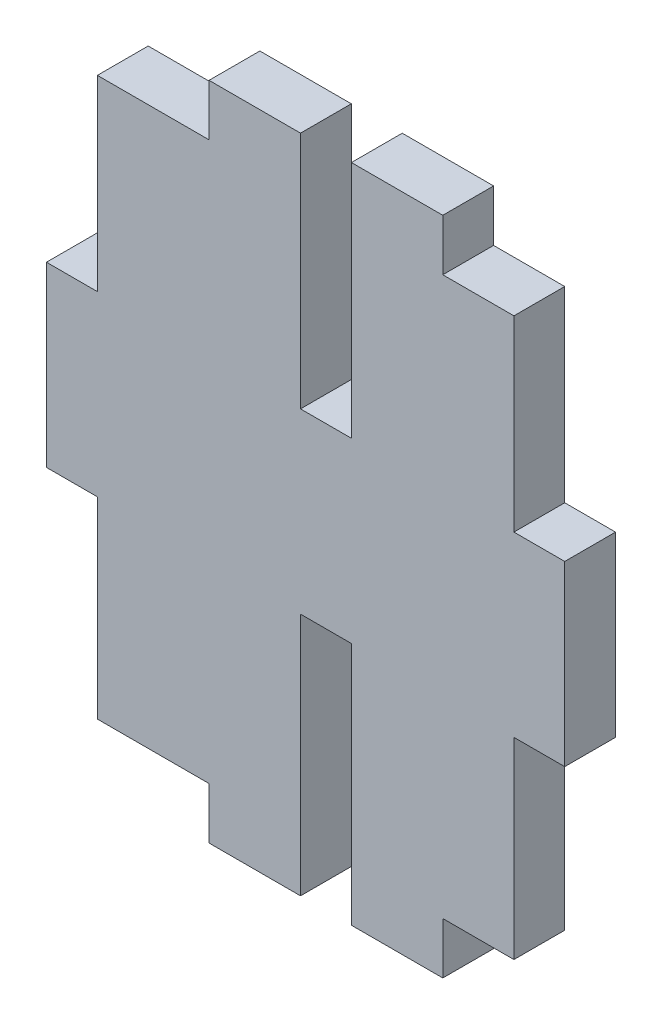
ISO-10303-21;
HEADER;
FILE_DESCRIPTION(('STEP AP214'),'2;1');
FILE_NAME('part.step','',(''),(''),'','','');
FILE_SCHEMA(('AUTOMOTIVE_DESIGN { 1 0 10303 214 1 1 1 1 }'));
ENDSEC;
DATA;
#1=APPLICATION_CONTEXT('core data for automotive mechanical design processes');
#2=APPLICATION_PROTOCOL_DEFINITION('international standard','automotive_design',2000,#1);
#3=PRODUCT_CONTEXT('',#1,'mechanical');
#4=PRODUCT('Part','Part','',(#3));
#5=PRODUCT_RELATED_PRODUCT_CATEGORY('part','',(#4));
#6=PRODUCT_DEFINITION_FORMATION('','',#4);
#7=PRODUCT_DEFINITION_CONTEXT('part definition',#1,'design');
#8=PRODUCT_DEFINITION('design','',#6,#7);
#9=PRODUCT_DEFINITION_SHAPE('','',#8);
#10=(LENGTH_UNIT() NAMED_UNIT(*) SI_UNIT(.MILLI.,.METRE.));
#11=(NAMED_UNIT(*) PLANE_ANGLE_UNIT() SI_UNIT($,.RADIAN.));
#12=(NAMED_UNIT(*) SI_UNIT($,.STERADIAN.) SOLID_ANGLE_UNIT());
#13=UNCERTAINTY_MEASURE_WITH_UNIT(LENGTH_MEASURE(1.E-05),#10,'distance_accuracy_value','');
#14=(GEOMETRIC_REPRESENTATION_CONTEXT(3) GLOBAL_UNCERTAINTY_ASSIGNED_CONTEXT((#13)) GLOBAL_UNIT_ASSIGNED_CONTEXT((#10,
#11,#12)) REPRESENTATION_CONTEXT('',''));
#15=CARTESIAN_POINT('',(0.,0.,0.));
#16=DIRECTION('',(0.,0.,1.));
#17=DIRECTION('',(1.,0.,0.));
#18=AXIS2_PLACEMENT_3D('',#15,#16,#17);
#19=CARTESIAN_POINT('',(25.5,-32.5,5.));
#20=DIRECTION('',(0.,1.,0.));
#21=DIRECTION('',(0.,0.,1.));
#22=AXIS2_PLACEMENT_3D('',#19,#20,#21);
#23=PLANE('',#22);
#24=DIRECTION('',(1.,0.,0.));
#25=VECTOR('',#24,1.);
#26=CARTESIAN_POINT('',(25.5,-32.5,5.));
#27=LINE('',#26,#25);
#28=CARTESIAN_POINT('',(-9.49999999999998,-32.5,5.));
#29=VERTEX_POINT('',#28);
#30=CARTESIAN_POINT('',(-0.499999999999983,-32.5,5.));
#31=VERTEX_POINT('',#30);
#32=EDGE_CURVE('E233',#29,#31,#27,.T.);
#33=ORIENTED_EDGE('',*,*,#32,.F.);
#34=DIRECTION('',(0.,0.,1.));
#35=VECTOR('',#34,1.);
#36=CARTESIAN_POINT('',(-9.49999999999998,-32.5,0.));
#37=LINE('',#36,#35);
#38=CARTESIAN_POINT('',(-9.49999999999998,-32.5,0.));
#39=VERTEX_POINT('',#38);
#40=EDGE_CURVE('E219',#39,#29,#37,.T.);
#41=ORIENTED_EDGE('',*,*,#40,.F.);
#42=DIRECTION('',(1.,0.,0.));
#43=VECTOR('',#42,1.);
#44=CARTESIAN_POINT('',(25.5,-32.5,0.));
#45=LINE('',#44,#43);
#46=CARTESIAN_POINT('',(-0.499999999999983,-32.5,0.));
#47=VERTEX_POINT('',#46);
#48=EDGE_CURVE('E231',#39,#47,#45,.T.);
#49=ORIENTED_EDGE('',*,*,#48,.T.);
#50=DIRECTION('',(0.,0.,1.));
#51=VECTOR('',#50,1.);
#52=CARTESIAN_POINT('',(-0.499999999999983,-32.5,0.));
#53=LINE('',#52,#51);
#54=EDGE_CURVE('E422',#47,#31,#53,.T.);
#55=ORIENTED_EDGE('',*,*,#54,.T.);
#56=EDGE_LOOP('',(#33,#41,#49,#55));
#57=FACE_BOUND('',#56,.T.);
#58=ADVANCED_FACE('F32',(#57),#23,.F.);
#59=CARTESIAN_POINT('',(25.5,32.5,5.));
#60=DIRECTION('',(0.,-1.,0.));
#61=DIRECTION('',(1.,0.,0.));
#62=AXIS2_PLACEMENT_3D('',#59,#60,#61);
#63=PLANE('',#62);
#64=DIRECTION('',(-1.,0.,0.));
#65=VECTOR('',#64,1.);
#66=CARTESIAN_POINT('',(25.5,32.5,0.));
#67=LINE('',#66,#65);
#68=CARTESIAN_POINT('',(-0.499999999999987,32.5,0.));
#69=VERTEX_POINT('',#68);
#70=CARTESIAN_POINT('',(-9.49999999999999,32.5,0.));
#71=VERTEX_POINT('',#70);
#72=EDGE_CURVE('E243',#69,#71,#67,.T.);
#73=ORIENTED_EDGE('',*,*,#72,.T.);
#74=DIRECTION('',(0.,0.,1.));
#75=VECTOR('',#74,1.);
#76=CARTESIAN_POINT('',(-9.49999999999999,32.5,0.));
#77=LINE('',#76,#75);
#78=CARTESIAN_POINT('',(-9.49999999999999,32.5,5.));
#79=VERTEX_POINT('',#78);
#80=EDGE_CURVE('E368',#71,#79,#77,.T.);
#81=ORIENTED_EDGE('',*,*,#80,.T.);
#82=DIRECTION('',(-1.,0.,0.));
#83=VECTOR('',#82,1.);
#84=CARTESIAN_POINT('',(25.5,32.5,5.));
#85=LINE('',#84,#83);
#86=CARTESIAN_POINT('',(-0.499999999999987,32.5,5.));
#87=VERTEX_POINT('',#86);
#88=EDGE_CURVE('E352',#87,#79,#85,.T.);
#89=ORIENTED_EDGE('',*,*,#88,.F.);
#90=DIRECTION('',(0.,0.,1.));
#91=VECTOR('',#90,1.);
#92=CARTESIAN_POINT('',(-0.499999999999987,32.5,0.));
#93=LINE('',#92,#91);
#94=EDGE_CURVE('E308',#69,#87,#93,.T.);
#95=ORIENTED_EDGE('',*,*,#94,.F.);
#96=EDGE_LOOP('',(#73,#81,#89,#95));
#97=FACE_BOUND('',#96,.T.);
#98=ADVANCED_FACE('F366',(#97),#63,.F.);
#99=CARTESIAN_POINT('',(-25.5,-32.5,5.));
#100=DIRECTION('',(1.,0.,0.));
#101=DIRECTION('',(0.,0.,-1.));
#102=AXIS2_PLACEMENT_3D('',#99,#100,#101);
#103=PLANE('',#102);
#104=DIRECTION('',(0.,-1.,0.));
#105=VECTOR('',#104,1.);
#106=CARTESIAN_POINT('',(-25.5,-32.5,0.));
#107=LINE('',#106,#105);
#108=CARTESIAN_POINT('',(-25.5,9.,0.));
#109=VERTEX_POINT('',#108);
#110=CARTESIAN_POINT('',(-25.5,-8.49,0.));
#111=VERTEX_POINT('',#110);
#112=EDGE_CURVE('E246',#109,#111,#107,.T.);
#113=ORIENTED_EDGE('',*,*,#112,.T.);
#114=DIRECTION('',(0.,0.,1.));
#115=VECTOR('',#114,1.);
#116=CARTESIAN_POINT('',(-25.5,-8.49,0.));
#117=LINE('',#116,#115);
#118=CARTESIAN_POINT('',(-25.5,-8.49,5.));
#119=VERTEX_POINT('',#118);
#120=EDGE_CURVE('E326',#111,#119,#117,.T.);
#121=ORIENTED_EDGE('',*,*,#120,.T.);
#122=DIRECTION('',(0.,-1.,0.));
#123=VECTOR('',#122,1.);
#124=CARTESIAN_POINT('',(-25.5,-32.5,5.));
#125=LINE('',#124,#123);
#126=CARTESIAN_POINT('',(-25.5,9.,5.));
#127=VERTEX_POINT('',#126);
#128=EDGE_CURVE('E252',#127,#119,#125,.T.);
#129=ORIENTED_EDGE('',*,*,#128,.F.);
#130=DIRECTION('',(0.,0.,1.));
#131=VECTOR('',#130,1.);
#132=CARTESIAN_POINT('',(-25.5,9.,0.));
#133=LINE('',#132,#131);
#134=EDGE_CURVE('E339',#109,#127,#133,.T.);
#135=ORIENTED_EDGE('',*,*,#134,.F.);
#136=EDGE_LOOP('',(#113,#121,#129,#135));
#137=FACE_BOUND('',#136,.T.);
#138=ADVANCED_FACE('F34',(#137),#103,.F.);
#139=CARTESIAN_POINT('',(4.51000000000002,-32.5,0.));
#140=VERTEX_POINT('',#139);
#141=CARTESIAN_POINT('',(13.5,-32.5,0.));
#142=VERTEX_POINT('',#141);
#143=EDGE_CURVE('E241',#140,#142,#45,.T.);
#144=ORIENTED_EDGE('',*,*,#143,.T.);
#145=DIRECTION('',(0.,0.,1.));
#146=VECTOR('',#145,1.);
#147=CARTESIAN_POINT('',(13.5,-32.5,0.));
#148=LINE('',#147,#146);
#149=CARTESIAN_POINT('',(13.5,-32.5,5.));
#150=VERTEX_POINT('',#149);
#151=EDGE_CURVE('E393',#142,#150,#148,.T.);
#152=ORIENTED_EDGE('',*,*,#151,.T.);
#153=CARTESIAN_POINT('',(4.51000000000002,-32.5,5.));
#154=VERTEX_POINT('',#153);
#155=EDGE_CURVE('E349',#154,#150,#27,.T.);
#156=ORIENTED_EDGE('',*,*,#155,.F.);
#157=DIRECTION('',(0.,0.,1.));
#158=VECTOR('',#157,1.);
#159=CARTESIAN_POINT('',(4.51000000000002,-32.5,0.));
#160=LINE('',#159,#158);
#161=EDGE_CURVE('E431',#140,#154,#160,.T.);
#162=ORIENTED_EDGE('',*,*,#161,.F.);
#163=EDGE_LOOP('',(#144,#152,#156,#162));
#164=FACE_BOUND('',#163,.T.);
#165=ADVANCED_FACE('F461',(#164),#23,.F.);
#166=CARTESIAN_POINT('',(25.5,-32.5,5.));
#167=DIRECTION('',(-1.,0.,0.));
#168=DIRECTION('',(0.,0.,1.));
#169=AXIS2_PLACEMENT_3D('',#166,#167,#168);
#170=PLANE('',#169);
#171=DIRECTION('',(0.,1.,0.));
#172=VECTOR('',#171,1.);
#173=CARTESIAN_POINT('',(25.5,-32.5,5.));
#174=LINE('',#173,#172);
#175=CARTESIAN_POINT('',(25.5,-8.49,5.));
#176=VERTEX_POINT('',#175);
#177=CARTESIAN_POINT('',(25.5,9.,5.));
#178=VERTEX_POINT('',#177);
#179=EDGE_CURVE('E351',#176,#178,#174,.T.);
#180=ORIENTED_EDGE('',*,*,#179,.F.);
#181=DIRECTION('',(0.,0.,1.));
#182=VECTOR('',#181,1.);
#183=CARTESIAN_POINT('',(25.5,-8.49,0.));
#184=LINE('',#183,#182);
#185=CARTESIAN_POINT('',(25.5,-8.49,0.));
#186=VERTEX_POINT('',#185);
#187=EDGE_CURVE('E406',#186,#176,#184,.T.);
#188=ORIENTED_EDGE('',*,*,#187,.F.);
#189=DIRECTION('',(0.,1.,0.));
#190=VECTOR('',#189,1.);
#191=CARTESIAN_POINT('',(25.5,-32.5,0.));
#192=LINE('',#191,#190);
#193=CARTESIAN_POINT('',(25.5,9.,0.));
#194=VERTEX_POINT('',#193);
#195=EDGE_CURVE('E240',#186,#194,#192,.T.);
#196=ORIENTED_EDGE('',*,*,#195,.T.);
#197=DIRECTION('',(0.,0.,1.));
#198=VECTOR('',#197,1.);
#199=CARTESIAN_POINT('',(25.5,9.,0.));
#200=LINE('',#199,#198);
#201=EDGE_CURVE('E284',#194,#178,#200,.T.);
#202=ORIENTED_EDGE('',*,*,#201,.T.);
#203=EDGE_LOOP('',(#180,#188,#196,#202));
#204=FACE_BOUND('',#203,.T.);
#205=ADVANCED_FACE('F441',(#204),#170,.F.);
#206=CARTESIAN_POINT('',(13.5,32.5,5.));
#207=VERTEX_POINT('',#206);
#208=CARTESIAN_POINT('',(4.51000000000001,32.5,5.));
#209=VERTEX_POINT('',#208);
#210=EDGE_CURVE('E257',#207,#209,#85,.T.);
#211=ORIENTED_EDGE('',*,*,#210,.F.);
#212=DIRECTION('',(0.,0.,1.));
#213=VECTOR('',#212,1.);
#214=CARTESIAN_POINT('',(13.5,32.5,0.));
#215=LINE('',#214,#213);
#216=CARTESIAN_POINT('',(13.5,32.5,0.));
#217=VERTEX_POINT('',#216);
#218=EDGE_CURVE('E490',#217,#207,#215,.T.);
#219=ORIENTED_EDGE('',*,*,#218,.F.);
#220=CARTESIAN_POINT('',(4.51000000000001,32.5,0.));
#221=VERTEX_POINT('',#220);
#222=EDGE_CURVE('E250',#217,#221,#67,.T.);
#223=ORIENTED_EDGE('',*,*,#222,.T.);
#224=DIRECTION('',(0.,0.,1.));
#225=VECTOR('',#224,1.);
#226=CARTESIAN_POINT('',(4.51000000000001,32.5,0.));
#227=LINE('',#226,#225);
#228=EDGE_CURVE('E311',#221,#209,#227,.T.);
#229=ORIENTED_EDGE('',*,*,#228,.T.);
#230=EDGE_LOOP('',(#211,#219,#223,#229));
#231=FACE_BOUND('',#230,.T.);
#232=ADVANCED_FACE('F534',(#231),#63,.F.);
#233=CARTESIAN_POINT('',(0.,0.,5.));
#234=DIRECTION('',(0.,0.,1.));
#235=DIRECTION('',(1.,0.,0.));
#236=AXIS2_PLACEMENT_3D('',#233,#234,#235);
#237=PLANE('',#236);
#238=DIRECTION('',(-1.,0.,0.));
#239=VECTOR('',#238,1.);
#240=CARTESIAN_POINT('',(-9.49999999999998,-27.43,5.));
#241=LINE('',#240,#239);
#242=CARTESIAN_POINT('',(-9.49999999999998,-27.43,5.));
#243=VERTEX_POINT('',#242);
#244=CARTESIAN_POINT('',(-20.49,-27.43,5.));
#245=VERTEX_POINT('',#244);
#246=EDGE_CURVE('E47',#243,#245,#241,.T.);
#247=ORIENTED_EDGE('',*,*,#246,.F.);
#248=DIRECTION('',(0.,1.,0.));
#249=VECTOR('',#248,1.);
#250=CARTESIAN_POINT('',(-9.49999999999998,-32.5,5.));
#251=LINE('',#250,#249);
#252=EDGE_CURVE('E473',#29,#243,#251,.T.);
#253=ORIENTED_EDGE('',*,*,#252,.F.);
#254=ORIENTED_EDGE('',*,*,#32,.T.);
#255=DIRECTION('',(0.,-1.,0.));
#256=VECTOR('',#255,1.);
#257=CARTESIAN_POINT('',(-0.499999999999986,-8.48999999999999,5.));
#258=LINE('',#257,#256);
#259=CARTESIAN_POINT('',(-0.499999999999986,-8.48999999999999,5.));
#260=VERTEX_POINT('',#259);
#261=EDGE_CURVE('E413',#260,#31,#258,.T.);
#262=ORIENTED_EDGE('',*,*,#261,.F.);
#263=DIRECTION('',(-1.,0.,0.));
#264=VECTOR('',#263,1.);
#265=CARTESIAN_POINT('',(-0.499999999999986,-8.48999999999999,5.));
#266=LINE('',#265,#264);
#267=CARTESIAN_POINT('',(4.51000000000001,-8.48999999999999,5.));
#268=VERTEX_POINT('',#267);
#269=EDGE_CURVE('E417',#268,#260,#266,.T.);
#270=ORIENTED_EDGE('',*,*,#269,.F.);
#271=DIRECTION('',(0.,1.,0.));
#272=VECTOR('',#271,1.);
#273=CARTESIAN_POINT('',(4.51000000000001,-8.48999999999999,5.));
#274=LINE('',#273,#272);
#275=EDGE_CURVE('E425',#154,#268,#274,.T.);
#276=ORIENTED_EDGE('',*,*,#275,.F.);
#277=ORIENTED_EDGE('',*,*,#155,.T.);
#278=DIRECTION('',(0.,-1.,0.));
#279=VECTOR('',#278,1.);
#280=CARTESIAN_POINT('',(13.5,-32.5,5.));
#281=LINE('',#280,#279);
#282=CARTESIAN_POINT('',(13.5,-27.43,5.));
#283=VERTEX_POINT('',#282);
#284=EDGE_CURVE('E387',#283,#150,#281,.T.);
#285=ORIENTED_EDGE('',*,*,#284,.F.);
#286=DIRECTION('',(-1.,0.,0.));
#287=VECTOR('',#286,1.);
#288=CARTESIAN_POINT('',(13.5,-27.43,5.));
#289=LINE('',#288,#287);
#290=CARTESIAN_POINT('',(20.5,-27.43,5.));
#291=VERTEX_POINT('',#290);
#292=EDGE_CURVE('E376',#291,#283,#289,.T.);
#293=ORIENTED_EDGE('',*,*,#292,.F.);
#294=DIRECTION('',(0.,-1.,0.));
#295=VECTOR('',#294,1.);
#296=CARTESIAN_POINT('',(20.5,-32.5,5.));
#297=LINE('',#296,#295);
#298=CARTESIAN_POINT('',(20.5,-8.49,5.));
#299=VERTEX_POINT('',#298);
#300=EDGE_CURVE('E403',#299,#291,#297,.T.);
#301=ORIENTED_EDGE('',*,*,#300,.F.);
#302=DIRECTION('',(-1.,0.,0.));
#303=VECTOR('',#302,1.);
#304=CARTESIAN_POINT('',(20.5,-8.49,5.));
#305=LINE('',#304,#303);
#306=EDGE_CURVE('E396',#176,#299,#305,.T.);
#307=ORIENTED_EDGE('',*,*,#306,.F.);
#308=ORIENTED_EDGE('',*,*,#179,.T.);
#309=DIRECTION('',(1.,0.,0.));
#310=VECTOR('',#309,1.);
#311=CARTESIAN_POINT('',(20.5,9.,5.));
#312=LINE('',#311,#310);
#313=CARTESIAN_POINT('',(20.5,9.,5.));
#314=VERTEX_POINT('',#313);
#315=EDGE_CURVE('E274',#314,#178,#312,.T.);
#316=ORIENTED_EDGE('',*,*,#315,.F.);
#317=DIRECTION('',(0.,-1.,0.));
#318=VECTOR('',#317,1.);
#319=CARTESIAN_POINT('',(20.5,32.5,5.));
#320=LINE('',#319,#318);
#321=CARTESIAN_POINT('',(20.5,27.43,5.));
#322=VERTEX_POINT('',#321);
#323=EDGE_CURVE('E264',#322,#314,#320,.T.);
#324=ORIENTED_EDGE('',*,*,#323,.F.);
#325=DIRECTION('',(1.,0.,0.));
#326=VECTOR('',#325,1.);
#327=CARTESIAN_POINT('',(13.5,27.43,5.));
#328=LINE('',#327,#326);
#329=CARTESIAN_POINT('',(13.5,27.43,5.));
#330=VERTEX_POINT('',#329);
#331=EDGE_CURVE('E54',#330,#322,#328,.T.);
#332=ORIENTED_EDGE('',*,*,#331,.F.);
#333=DIRECTION('',(0.,-1.,0.));
#334=VECTOR('',#333,1.);
#335=CARTESIAN_POINT('',(13.5,32.5,5.));
#336=LINE('',#335,#334);
#337=EDGE_CURVE('E479',#207,#330,#336,.T.);
#338=ORIENTED_EDGE('',*,*,#337,.F.);
#339=ORIENTED_EDGE('',*,*,#210,.T.);
#340=DIRECTION('',(0.,1.,0.));
#341=VECTOR('',#340,1.);
#342=CARTESIAN_POINT('',(4.51000000000001,32.5,5.));
#343=LINE('',#342,#341);
#344=CARTESIAN_POINT('',(4.51000000000002,9.00000000000001,5.));
#345=VERTEX_POINT('',#344);
#346=EDGE_CURVE('E294',#345,#209,#343,.T.);
#347=ORIENTED_EDGE('',*,*,#346,.F.);
#348=DIRECTION('',(1.,0.,0.));
#349=VECTOR('',#348,1.);
#350=CARTESIAN_POINT('',(-0.499999999999984,9.00000000000001,5.));
#351=LINE('',#350,#349);
#352=CARTESIAN_POINT('',(-0.499999999999984,9.00000000000001,5.));
#353=VERTEX_POINT('',#352);
#354=EDGE_CURVE('E303',#353,#345,#351,.T.);
#355=ORIENTED_EDGE('',*,*,#354,.F.);
#356=DIRECTION('',(0.,-1.,0.));
#357=VECTOR('',#356,1.);
#358=CARTESIAN_POINT('',(-0.499999999999987,32.5,5.));
#359=LINE('',#358,#357);
#360=EDGE_CURVE('E287',#87,#353,#359,.T.);
#361=ORIENTED_EDGE('',*,*,#360,.F.);
#362=ORIENTED_EDGE('',*,*,#88,.T.);
#363=DIRECTION('',(0.,1.,0.));
#364=VECTOR('',#363,1.);
#365=CARTESIAN_POINT('',(-9.49999999999999,32.5,5.));
#366=LINE('',#365,#364);
#367=CARTESIAN_POINT('',(-9.49999999999999,27.43,5.));
#368=VERTEX_POINT('',#367);
#369=EDGE_CURVE('E360',#368,#79,#366,.T.);
#370=ORIENTED_EDGE('',*,*,#369,.F.);
#371=DIRECTION('',(1.,0.,0.));
#372=VECTOR('',#371,1.);
#373=CARTESIAN_POINT('',(-9.49999999999999,27.43,5.));
#374=LINE('',#373,#372);
#375=CARTESIAN_POINT('',(-20.49,27.43,5.));
#376=VERTEX_POINT('',#375);
#377=EDGE_CURVE('E493',#376,#368,#374,.T.);
#378=ORIENTED_EDGE('',*,*,#377,.F.);
#379=DIRECTION('',(0.,1.,0.));
#380=VECTOR('',#379,1.);
#381=CARTESIAN_POINT('',(-20.49,9.,5.));
#382=LINE('',#381,#380);
#383=CARTESIAN_POINT('',(-20.49,9.,5.));
#384=VERTEX_POINT('',#383);
#385=EDGE_CURVE('E336',#384,#376,#382,.T.);
#386=ORIENTED_EDGE('',*,*,#385,.F.);
#387=DIRECTION('',(1.,0.,0.));
#388=VECTOR('',#387,1.);
#389=CARTESIAN_POINT('',(-25.5,9.,5.));
#390=LINE('',#389,#388);
#391=EDGE_CURVE('E329',#127,#384,#390,.T.);
#392=ORIENTED_EDGE('',*,*,#391,.F.);
#393=ORIENTED_EDGE('',*,*,#128,.T.);
#394=DIRECTION('',(-1.,0.,0.));
#395=VECTOR('',#394,1.);
#396=CARTESIAN_POINT('',(-25.5,-8.49,5.));
#397=LINE('',#396,#395);
#398=CARTESIAN_POINT('',(-20.49,-8.49,5.));
#399=VERTEX_POINT('',#398);
#400=EDGE_CURVE('E320',#399,#119,#397,.T.);
#401=ORIENTED_EDGE('',*,*,#400,.F.);
#402=DIRECTION('',(0.,1.,0.));
#403=VECTOR('',#402,1.);
#404=CARTESIAN_POINT('',(-20.49,-8.49,5.));
#405=LINE('',#404,#403);
#406=EDGE_CURVE('E310',#245,#399,#405,.T.);
#407=ORIENTED_EDGE('',*,*,#406,.F.);
#408=EDGE_LOOP('',(#247,#253,#254,#262,#270,#276,#277,#285,#293,#301,#307,#308,#316,#324,#332,
#338,#339,#347,#355,#361,#362,#370,#378,#386,#392,#393,#401,#407));
#409=FACE_BOUND('',#408,.T.);
#410=ADVANCED_FACE('F271',(#409),#237,.T.);
#411=CARTESIAN_POINT('',(0.,0.,0.));
#412=DIRECTION('',(0.,0.,1.));
#413=DIRECTION('',(1.,0.,0.));
#414=AXIS2_PLACEMENT_3D('',#411,#412,#413);
#415=PLANE('',#414);
#416=DIRECTION('',(0.,1.,0.));
#417=VECTOR('',#416,1.);
#418=CARTESIAN_POINT('',(-9.49999999999998,-32.5,0.));
#419=LINE('',#418,#417);
#420=CARTESIAN_POINT('',(-9.49999999999998,-27.43,0.));
#421=VERTEX_POINT('',#420);
#422=EDGE_CURVE('E215',#39,#421,#419,.T.);
#423=ORIENTED_EDGE('',*,*,#422,.T.);
#424=DIRECTION('',(-1.,0.,0.));
#425=VECTOR('',#424,1.);
#426=CARTESIAN_POINT('',(-9.49999999999998,-27.43,0.));
#427=LINE('',#426,#425);
#428=CARTESIAN_POINT('',(-20.49,-27.43,0.));
#429=VERTEX_POINT('',#428);
#430=EDGE_CURVE('E226',#421,#429,#427,.T.);
#431=ORIENTED_EDGE('',*,*,#430,.T.);
#432=DIRECTION('',(0.,1.,0.));
#433=VECTOR('',#432,1.);
#434=CARTESIAN_POINT('',(-20.49,-8.49,0.));
#435=LINE('',#434,#433);
#436=CARTESIAN_POINT('',(-20.49,-8.49,0.));
#437=VERTEX_POINT('',#436);
#438=EDGE_CURVE('E317',#429,#437,#435,.T.);
#439=ORIENTED_EDGE('',*,*,#438,.T.);
#440=DIRECTION('',(-1.,0.,0.));
#441=VECTOR('',#440,1.);
#442=CARTESIAN_POINT('',(-25.5,-8.49,0.));
#443=LINE('',#442,#441);
#444=EDGE_CURVE('E319',#437,#111,#443,.T.);
#445=ORIENTED_EDGE('',*,*,#444,.T.);
#446=ORIENTED_EDGE('',*,*,#112,.F.);
#447=DIRECTION('',(1.,0.,0.));
#448=VECTOR('',#447,1.);
#449=CARTESIAN_POINT('',(-25.5,9.,0.));
#450=LINE('',#449,#448);
#451=CARTESIAN_POINT('',(-20.49,9.,0.));
#452=VERTEX_POINT('',#451);
#453=EDGE_CURVE('E332',#109,#452,#450,.T.);
#454=ORIENTED_EDGE('',*,*,#453,.T.);
#455=DIRECTION('',(0.,1.,0.));
#456=VECTOR('',#455,1.);
#457=CARTESIAN_POINT('',(-20.49,9.,0.));
#458=LINE('',#457,#456);
#459=CARTESIAN_POINT('',(-20.49,27.43,0.));
#460=VERTEX_POINT('',#459);
#461=EDGE_CURVE('E335',#452,#460,#458,.T.);
#462=ORIENTED_EDGE('',*,*,#461,.T.);
#463=DIRECTION('',(1.,0.,0.));
#464=VECTOR('',#463,1.);
#465=CARTESIAN_POINT('',(-9.49999999999999,27.43,0.));
#466=LINE('',#465,#464);
#467=CARTESIAN_POINT('',(-9.49999999999999,27.43,0.));
#468=VERTEX_POINT('',#467);
#469=EDGE_CURVE('E373',#460,#468,#466,.T.);
#470=ORIENTED_EDGE('',*,*,#469,.T.);
#471=DIRECTION('',(0.,1.,0.));
#472=VECTOR('',#471,1.);
#473=CARTESIAN_POINT('',(-9.49999999999999,32.5,0.));
#474=LINE('',#473,#472);
#475=EDGE_CURVE('E379',#468,#71,#474,.T.);
#476=ORIENTED_EDGE('',*,*,#475,.T.);
#477=ORIENTED_EDGE('',*,*,#72,.F.);
#478=DIRECTION('',(0.,-1.,0.));
#479=VECTOR('',#478,1.);
#480=CARTESIAN_POINT('',(-0.499999999999987,32.5,0.));
#481=LINE('',#480,#479);
#482=CARTESIAN_POINT('',(-0.499999999999984,9.00000000000001,0.));
#483=VERTEX_POINT('',#482);
#484=EDGE_CURVE('E290',#69,#483,#481,.T.);
#485=ORIENTED_EDGE('',*,*,#484,.T.);
#486=DIRECTION('',(1.,0.,0.));
#487=VECTOR('',#486,1.);
#488=CARTESIAN_POINT('',(-0.499999999999984,9.00000000000001,0.));
#489=LINE('',#488,#487);
#490=CARTESIAN_POINT('',(4.51000000000002,9.00000000000001,0.));
#491=VERTEX_POINT('',#490);
#492=EDGE_CURVE('E293',#483,#491,#489,.T.);
#493=ORIENTED_EDGE('',*,*,#492,.T.);
#494=DIRECTION('',(0.,1.,0.));
#495=VECTOR('',#494,1.);
#496=CARTESIAN_POINT('',(4.51000000000001,32.5,0.));
#497=LINE('',#496,#495);
#498=EDGE_CURVE('E297',#491,#221,#497,.T.);
#499=ORIENTED_EDGE('',*,*,#498,.T.);
#500=ORIENTED_EDGE('',*,*,#222,.F.);
#501=DIRECTION('',(0.,-1.,0.));
#502=VECTOR('',#501,1.);
#503=CARTESIAN_POINT('',(13.5,32.5,0.));
#504=LINE('',#503,#502);
#505=CARTESIAN_POINT('',(13.5,27.43,0.));
#506=VERTEX_POINT('',#505);
#507=EDGE_CURVE('E481',#217,#506,#504,.T.);
#508=ORIENTED_EDGE('',*,*,#507,.T.);
#509=DIRECTION('',(1.,0.,0.));
#510=VECTOR('',#509,1.);
#511=CARTESIAN_POINT('',(13.5,27.43,0.));
#512=LINE('',#511,#510);
#513=CARTESIAN_POINT('',(20.5,27.43,0.));
#514=VERTEX_POINT('',#513);
#515=EDGE_CURVE('E484',#506,#514,#512,.T.);
#516=ORIENTED_EDGE('',*,*,#515,.T.);
#517=DIRECTION('',(0.,-1.,0.));
#518=VECTOR('',#517,1.);
#519=CARTESIAN_POINT('',(20.5,32.5,0.));
#520=LINE('',#519,#518);
#521=CARTESIAN_POINT('',(20.5,9.,0.));
#522=VERTEX_POINT('',#521);
#523=EDGE_CURVE('E266',#514,#522,#520,.T.);
#524=ORIENTED_EDGE('',*,*,#523,.T.);
#525=DIRECTION('',(1.,0.,0.));
#526=VECTOR('',#525,1.);
#527=CARTESIAN_POINT('',(20.5,9.,0.));
#528=LINE('',#527,#526);
#529=EDGE_CURVE('E281',#522,#194,#528,.T.);
#530=ORIENTED_EDGE('',*,*,#529,.T.);
#531=ORIENTED_EDGE('',*,*,#195,.F.);
#532=DIRECTION('',(-1.,0.,0.));
#533=VECTOR('',#532,1.);
#534=CARTESIAN_POINT('',(20.5,-8.49,0.));
#535=LINE('',#534,#533);
#536=CARTESIAN_POINT('',(20.5,-8.49,0.));
#537=VERTEX_POINT('',#536);
#538=EDGE_CURVE('E399',#186,#537,#535,.T.);
#539=ORIENTED_EDGE('',*,*,#538,.T.);
#540=DIRECTION('',(0.,-1.,0.));
#541=VECTOR('',#540,1.);
#542=CARTESIAN_POINT('',(20.5,-32.5,0.));
#543=LINE('',#542,#541);
#544=CARTESIAN_POINT('',(20.5,-27.43,0.));
#545=VERTEX_POINT('',#544);
#546=EDGE_CURVE('E402',#537,#545,#543,.T.);
#547=ORIENTED_EDGE('',*,*,#546,.T.);
#548=DIRECTION('',(-1.,0.,0.));
#549=VECTOR('',#548,1.);
#550=CARTESIAN_POINT('',(13.5,-27.43,0.));
#551=LINE('',#550,#549);
#552=CARTESIAN_POINT('',(13.5,-27.43,0.));
#553=VERTEX_POINT('',#552);
#554=EDGE_CURVE('E383',#545,#553,#551,.T.);
#555=ORIENTED_EDGE('',*,*,#554,.T.);
#556=DIRECTION('',(0.,-1.,0.));
#557=VECTOR('',#556,1.);
#558=CARTESIAN_POINT('',(13.5,-32.5,0.));
#559=LINE('',#558,#557);
#560=EDGE_CURVE('E386',#553,#142,#559,.T.);
#561=ORIENTED_EDGE('',*,*,#560,.T.);
#562=ORIENTED_EDGE('',*,*,#143,.F.);
#563=DIRECTION('',(0.,1.,0.));
#564=VECTOR('',#563,1.);
#565=CARTESIAN_POINT('',(4.51000000000001,-8.48999999999999,0.));
#566=LINE('',#565,#564);
#567=CARTESIAN_POINT('',(4.51000000000001,-8.48999999999999,0.));
#568=VERTEX_POINT('',#567);
#569=EDGE_CURVE('E416',#140,#568,#566,.T.);
#570=ORIENTED_EDGE('',*,*,#569,.T.);
#571=DIRECTION('',(-1.,0.,0.));
#572=VECTOR('',#571,1.);
#573=CARTESIAN_POINT('',(-0.499999999999986,-8.48999999999999,0.));
#574=LINE('',#573,#572);
#575=CARTESIAN_POINT('',(-0.499999999999986,-8.48999999999999,0.));
#576=VERTEX_POINT('',#575);
#577=EDGE_CURVE('E420',#568,#576,#574,.T.);
#578=ORIENTED_EDGE('',*,*,#577,.T.);
#579=DIRECTION('',(0.,-1.,0.));
#580=VECTOR('',#579,1.);
#581=CARTESIAN_POINT('',(-0.499999999999986,-8.48999999999999,0.));
#582=LINE('',#581,#580);
#583=EDGE_CURVE('E239',#576,#47,#582,.T.);
#584=ORIENTED_EDGE('',*,*,#583,.T.);
#585=ORIENTED_EDGE('',*,*,#48,.F.);
#586=EDGE_LOOP('',(#423,#431,#439,#445,#446,#454,#462,#470,#476,#477,#485,#493,#499,#500,#508,
#516,#524,#530,#531,#539,#547,#555,#561,#562,#570,#578,#584,#585));
#587=FACE_BOUND('',#586,.T.);
#588=ADVANCED_FACE('F236',(#587),#415,.F.);
#589=CARTESIAN_POINT('',(-20.49,9.,0.));
#590=DIRECTION('',(1.,0.,0.));
#591=DIRECTION('',(0.,0.,-1.));
#592=AXIS2_PLACEMENT_3D('',#589,#590,#591);
#593=PLANE('',#592);
#594=ORIENTED_EDGE('',*,*,#385,.T.);
#595=DIRECTION('',(0.,0.,-1.));
#596=VECTOR('',#595,1.);
#597=CARTESIAN_POINT('',(-20.49,27.43,0.));
#598=LINE('',#597,#596);
#599=EDGE_CURVE('E256',#376,#460,#598,.T.);
#600=ORIENTED_EDGE('',*,*,#599,.T.);
#601=ORIENTED_EDGE('',*,*,#461,.F.);
#602=DIRECTION('',(0.,0.,1.));
#603=VECTOR('',#602,1.);
#604=CARTESIAN_POINT('',(-20.49,9.,0.));
#605=LINE('',#604,#603);
#606=EDGE_CURVE('E344',#452,#384,#605,.T.);
#607=ORIENTED_EDGE('',*,*,#606,.T.);
#608=EDGE_LOOP('',(#594,#600,#601,#607));
#609=FACE_BOUND('',#608,.T.);
#610=ADVANCED_FACE('F500',(#609),#593,.F.);
#611=CARTESIAN_POINT('',(-25.5,9.,0.));
#612=DIRECTION('',(0.,-1.,0.));
#613=DIRECTION('',(0.,0.,-1.));
#614=AXIS2_PLACEMENT_3D('',#611,#612,#613);
#615=PLANE('',#614);
#616=ORIENTED_EDGE('',*,*,#391,.T.);
#617=ORIENTED_EDGE('',*,*,#606,.F.);
#618=ORIENTED_EDGE('',*,*,#453,.F.);
#619=ORIENTED_EDGE('',*,*,#134,.T.);
#620=EDGE_LOOP('',(#616,#617,#618,#619));
#621=FACE_BOUND('',#620,.T.);
#622=ADVANCED_FACE('F589',(#621),#615,.F.);
#623=CARTESIAN_POINT('',(-25.5,-8.49,0.));
#624=DIRECTION('',(0.,1.,0.));
#625=DIRECTION('',(0.,0.,1.));
#626=AXIS2_PLACEMENT_3D('',#623,#624,#625);
#627=PLANE('',#626);
#628=ORIENTED_EDGE('',*,*,#400,.T.);
#629=ORIENTED_EDGE('',*,*,#120,.F.);
#630=ORIENTED_EDGE('',*,*,#444,.F.);
#631=DIRECTION('',(0.,0.,1.));
#632=VECTOR('',#631,1.);
#633=CARTESIAN_POINT('',(-20.49,-8.49,0.));
#634=LINE('',#633,#632);
#635=EDGE_CURVE('E323',#437,#399,#634,.T.);
#636=ORIENTED_EDGE('',*,*,#635,.T.);
#637=EDGE_LOOP('',(#628,#629,#630,#636));
#638=FACE_BOUND('',#637,.T.);
#639=ADVANCED_FACE('F512',(#638),#627,.F.);
#640=CARTESIAN_POINT('',(-20.49,-8.49,0.));
#641=DIRECTION('',(1.,0.,0.));
#642=DIRECTION('',(0.,1.,0.));
#643=AXIS2_PLACEMENT_3D('',#640,#641,#642);
#644=PLANE('',#643);
#645=ORIENTED_EDGE('',*,*,#438,.F.);
#646=DIRECTION('',(0.,0.,1.));
#647=VECTOR('',#646,1.);
#648=CARTESIAN_POINT('',(-20.49,-27.43,0.));
#649=LINE('',#648,#647);
#650=EDGE_CURVE('E11',#429,#245,#649,.T.);
#651=ORIENTED_EDGE('',*,*,#650,.T.);
#652=ORIENTED_EDGE('',*,*,#406,.T.);
#653=ORIENTED_EDGE('',*,*,#635,.F.);
#654=EDGE_LOOP('',(#645,#651,#652,#653));
#655=FACE_BOUND('',#654,.T.);
#656=ADVANCED_FACE('F516',(#655),#644,.F.);
#657=CARTESIAN_POINT('',(-0.499999999999987,32.5,0.));
#658=DIRECTION('',(-1.,0.,0.));
#659=DIRECTION('',(0.,-1.,0.));
#660=AXIS2_PLACEMENT_3D('',#657,#658,#659);
#661=PLANE('',#660);
#662=ORIENTED_EDGE('',*,*,#360,.T.);
#663=DIRECTION('',(0.,0.,1.));
#664=VECTOR('',#663,1.);
#665=CARTESIAN_POINT('',(-0.499999999999984,9.00000000000001,0.));
#666=LINE('',#665,#664);
#667=EDGE_CURVE('E300',#483,#353,#666,.T.);
#668=ORIENTED_EDGE('',*,*,#667,.F.);
#669=ORIENTED_EDGE('',*,*,#484,.F.);
#670=ORIENTED_EDGE('',*,*,#94,.T.);
#671=EDGE_LOOP('',(#662,#668,#669,#670));
#672=FACE_BOUND('',#671,.T.);
#673=ADVANCED_FACE('F600',(#672),#661,.F.);
#674=CARTESIAN_POINT('',(4.51000000000001,32.5,0.));
#675=DIRECTION('',(1.,0.,0.));
#676=DIRECTION('',(0.,1.,0.));
#677=AXIS2_PLACEMENT_3D('',#674,#675,#676);
#678=PLANE('',#677);
#679=ORIENTED_EDGE('',*,*,#346,.T.);
#680=ORIENTED_EDGE('',*,*,#228,.F.);
#681=ORIENTED_EDGE('',*,*,#498,.F.);
#682=DIRECTION('',(0.,0.,1.));
#683=VECTOR('',#682,1.);
#684=CARTESIAN_POINT('',(4.51000000000002,9.00000000000001,0.));
#685=LINE('',#684,#683);
#686=EDGE_CURVE('E314',#491,#345,#685,.T.);
#687=ORIENTED_EDGE('',*,*,#686,.T.);
#688=EDGE_LOOP('',(#679,#680,#681,#687));
#689=FACE_BOUND('',#688,.T.);
#690=ADVANCED_FACE('F697',(#689),#678,.F.);
#691=CARTESIAN_POINT('',(-0.499999999999984,9.00000000000001,0.));
#692=DIRECTION('',(0.,-1.,0.));
#693=DIRECTION('',(0.,0.,-1.));
#694=AXIS2_PLACEMENT_3D('',#691,#692,#693);
#695=PLANE('',#694);
#696=ORIENTED_EDGE('',*,*,#354,.T.);
#697=ORIENTED_EDGE('',*,*,#686,.F.);
#698=ORIENTED_EDGE('',*,*,#492,.F.);
#699=ORIENTED_EDGE('',*,*,#667,.T.);
#700=EDGE_LOOP('',(#696,#697,#698,#699));
#701=FACE_BOUND('',#700,.T.);
#702=ADVANCED_FACE('F613',(#701),#695,.F.);
#703=CARTESIAN_POINT('',(20.5,32.5,0.));
#704=DIRECTION('',(-1.,0.,0.));
#705=DIRECTION('',(0.,-1.,0.));
#706=AXIS2_PLACEMENT_3D('',#703,#704,#705);
#707=PLANE('',#706);
#708=ORIENTED_EDGE('',*,*,#523,.F.);
#709=DIRECTION('',(0.,0.,1.));
#710=VECTOR('',#709,1.);
#711=CARTESIAN_POINT('',(20.5,27.43,0.));
#712=LINE('',#711,#710);
#713=EDGE_CURVE('E40',#514,#322,#712,.T.);
#714=ORIENTED_EDGE('',*,*,#713,.T.);
#715=ORIENTED_EDGE('',*,*,#323,.T.);
#716=DIRECTION('',(0.,0.,1.));
#717=VECTOR('',#716,1.);
#718=CARTESIAN_POINT('',(20.5,9.,0.));
#719=LINE('',#718,#717);
#720=EDGE_CURVE('E288',#522,#314,#719,.T.);
#721=ORIENTED_EDGE('',*,*,#720,.F.);
#722=EDGE_LOOP('',(#708,#714,#715,#721));
#723=FACE_BOUND('',#722,.T.);
#724=ADVANCED_FACE('F262',(#723),#707,.F.);
#725=CARTESIAN_POINT('',(20.5,9.,0.));
#726=DIRECTION('',(0.,-1.,0.));
#727=DIRECTION('',(0.,0.,-1.));
#728=AXIS2_PLACEMENT_3D('',#725,#726,#727);
#729=PLANE('',#728);
#730=ORIENTED_EDGE('',*,*,#315,.T.);
#731=ORIENTED_EDGE('',*,*,#201,.F.);
#732=ORIENTED_EDGE('',*,*,#529,.F.);
#733=ORIENTED_EDGE('',*,*,#720,.T.);
#734=EDGE_LOOP('',(#730,#731,#732,#733));
#735=FACE_BOUND('',#734,.T.);
#736=ADVANCED_FACE('F438',(#735),#729,.F.);
#737=CARTESIAN_POINT('',(-0.499999999999986,-8.48999999999999,0.));
#738=DIRECTION('',(-1.,0.,0.));
#739=DIRECTION('',(0.,-1.,0.));
#740=AXIS2_PLACEMENT_3D('',#737,#738,#739);
#741=PLANE('',#740);
#742=ORIENTED_EDGE('',*,*,#261,.T.);
#743=ORIENTED_EDGE('',*,*,#54,.F.);
#744=ORIENTED_EDGE('',*,*,#583,.F.);
#745=DIRECTION('',(0.,0.,1.));
#746=VECTOR('',#745,1.);
#747=CARTESIAN_POINT('',(-0.499999999999986,-8.48999999999999,0.));
#748=LINE('',#747,#746);
#749=EDGE_CURVE('E275',#576,#260,#748,.T.);
#750=ORIENTED_EDGE('',*,*,#749,.T.);
#751=EDGE_LOOP('',(#742,#743,#744,#750));
#752=FACE_BOUND('',#751,.T.);
#753=ADVANCED_FACE('F472',(#752),#741,.F.);
#754=CARTESIAN_POINT('',(-0.499999999999986,-8.48999999999999,0.));
#755=DIRECTION('',(0.,1.,0.));
#756=DIRECTION('',(0.,0.,1.));
#757=AXIS2_PLACEMENT_3D('',#754,#755,#756);
#758=PLANE('',#757);
#759=ORIENTED_EDGE('',*,*,#269,.T.);
#760=ORIENTED_EDGE('',*,*,#749,.F.);
#761=ORIENTED_EDGE('',*,*,#577,.F.);
#762=DIRECTION('',(0.,0.,1.));
#763=VECTOR('',#762,1.);
#764=CARTESIAN_POINT('',(4.51000000000001,-8.48999999999999,0.));
#765=LINE('',#764,#763);
#766=EDGE_CURVE('E278',#568,#268,#765,.T.);
#767=ORIENTED_EDGE('',*,*,#766,.T.);
#768=EDGE_LOOP('',(#759,#760,#761,#767));
#769=FACE_BOUND('',#768,.T.);
#770=ADVANCED_FACE('F470',(#769),#758,.F.);
#771=CARTESIAN_POINT('',(4.51000000000001,-8.48999999999999,0.));
#772=DIRECTION('',(1.,0.,0.));
#773=DIRECTION('',(0.,1.,0.));
#774=AXIS2_PLACEMENT_3D('',#771,#772,#773);
#775=PLANE('',#774);
#776=ORIENTED_EDGE('',*,*,#275,.T.);
#777=ORIENTED_EDGE('',*,*,#766,.F.);
#778=ORIENTED_EDGE('',*,*,#569,.F.);
#779=ORIENTED_EDGE('',*,*,#161,.T.);
#780=EDGE_LOOP('',(#776,#777,#778,#779));
#781=FACE_BOUND('',#780,.T.);
#782=ADVANCED_FACE('F468',(#781),#775,.F.);
#783=CARTESIAN_POINT('',(20.5,-32.5,0.));
#784=DIRECTION('',(-1.,0.,0.));
#785=DIRECTION('',(0.,-1.,0.));
#786=AXIS2_PLACEMENT_3D('',#783,#784,#785);
#787=PLANE('',#786);
#788=ORIENTED_EDGE('',*,*,#300,.T.);
#789=DIRECTION('',(0.,0.,-1.));
#790=VECTOR('',#789,1.);
#791=CARTESIAN_POINT('',(20.5,-27.43,0.));
#792=LINE('',#791,#790);
#793=EDGE_CURVE('E253',#291,#545,#792,.T.);
#794=ORIENTED_EDGE('',*,*,#793,.T.);
#795=ORIENTED_EDGE('',*,*,#546,.F.);
#796=DIRECTION('',(0.,0.,1.));
#797=VECTOR('',#796,1.);
#798=CARTESIAN_POINT('',(20.5,-8.49,0.));
#799=LINE('',#798,#797);
#800=EDGE_CURVE('E411',#537,#299,#799,.T.);
#801=ORIENTED_EDGE('',*,*,#800,.T.);
#802=EDGE_LOOP('',(#788,#794,#795,#801));
#803=FACE_BOUND('',#802,.T.);
#804=ADVANCED_FACE('F451',(#803),#787,.F.);
#805=CARTESIAN_POINT('',(20.5,-8.49,0.));
#806=DIRECTION('',(0.,1.,0.));
#807=DIRECTION('',(-1.,0.,0.));
#808=AXIS2_PLACEMENT_3D('',#805,#806,#807);
#809=PLANE('',#808);
#810=ORIENTED_EDGE('',*,*,#306,.T.);
#811=ORIENTED_EDGE('',*,*,#800,.F.);
#812=ORIENTED_EDGE('',*,*,#538,.F.);
#813=ORIENTED_EDGE('',*,*,#187,.T.);
#814=EDGE_LOOP('',(#810,#811,#812,#813));
#815=FACE_BOUND('',#814,.T.);
#816=ADVANCED_FACE('F445',(#815),#809,.F.);
#817=CARTESIAN_POINT('',(13.5,-27.43,0.));
#818=DIRECTION('',(0.,1.,0.));
#819=DIRECTION('',(-1.,0.,0.));
#820=AXIS2_PLACEMENT_3D('',#817,#818,#819);
#821=PLANE('',#820);
#822=ORIENTED_EDGE('',*,*,#292,.T.);
#823=DIRECTION('',(0.,0.,1.));
#824=VECTOR('',#823,1.);
#825=CARTESIAN_POINT('',(13.5,-27.43,0.));
#826=LINE('',#825,#824);
#827=EDGE_CURVE('E390',#553,#283,#826,.T.);
#828=ORIENTED_EDGE('',*,*,#827,.F.);
#829=ORIENTED_EDGE('',*,*,#554,.F.);
#830=ORIENTED_EDGE('',*,*,#793,.F.);
#831=EDGE_LOOP('',(#822,#828,#829,#830));
#832=FACE_BOUND('',#831,.T.);
#833=ADVANCED_FACE('F455',(#832),#821,.F.);
#834=CARTESIAN_POINT('',(13.5,-32.5,0.));
#835=DIRECTION('',(-1.,0.,0.));
#836=DIRECTION('',(0.,-1.,0.));
#837=AXIS2_PLACEMENT_3D('',#834,#835,#836);
#838=PLANE('',#837);
#839=ORIENTED_EDGE('',*,*,#284,.T.);
#840=ORIENTED_EDGE('',*,*,#151,.F.);
#841=ORIENTED_EDGE('',*,*,#560,.F.);
#842=ORIENTED_EDGE('',*,*,#827,.T.);
#843=EDGE_LOOP('',(#839,#840,#841,#842));
#844=FACE_BOUND('',#843,.T.);
#845=ADVANCED_FACE('F457',(#844),#838,.F.);
#846=CARTESIAN_POINT('',(-9.49999999999999,27.43,0.));
#847=DIRECTION('',(0.,-1.,0.));
#848=DIRECTION('',(1.,0.,0.));
#849=AXIS2_PLACEMENT_3D('',#846,#847,#848);
#850=PLANE('',#849);
#851=ORIENTED_EDGE('',*,*,#377,.T.);
#852=DIRECTION('',(0.,0.,1.));
#853=VECTOR('',#852,1.);
#854=CARTESIAN_POINT('',(-9.49999999999999,27.43,0.));
#855=LINE('',#854,#853);
#856=EDGE_CURVE('E372',#468,#368,#855,.T.);
#857=ORIENTED_EDGE('',*,*,#856,.F.);
#858=ORIENTED_EDGE('',*,*,#469,.F.);
#859=ORIENTED_EDGE('',*,*,#599,.F.);
#860=EDGE_LOOP('',(#851,#857,#858,#859));
#861=FACE_BOUND('',#860,.T.);
#862=ADVANCED_FACE('F496',(#861),#850,.F.);
#863=CARTESIAN_POINT('',(-9.49999999999999,32.5,0.));
#864=DIRECTION('',(1.,0.,0.));
#865=DIRECTION('',(0.,0.,-1.));
#866=AXIS2_PLACEMENT_3D('',#863,#864,#865);
#867=PLANE('',#866);
#868=ORIENTED_EDGE('',*,*,#369,.T.);
#869=ORIENTED_EDGE('',*,*,#80,.F.);
#870=ORIENTED_EDGE('',*,*,#475,.F.);
#871=ORIENTED_EDGE('',*,*,#856,.T.);
#872=EDGE_LOOP('',(#868,#869,#870,#871));
#873=FACE_BOUND('',#872,.T.);
#874=ADVANCED_FACE('F498',(#873),#867,.F.);
#875=CARTESIAN_POINT('',(13.5,27.43,0.));
#876=DIRECTION('',(0.,-1.,0.));
#877=DIRECTION('',(1.,0.,0.));
#878=AXIS2_PLACEMENT_3D('',#875,#876,#877);
#879=PLANE('',#878);
#880=ORIENTED_EDGE('',*,*,#515,.F.);
#881=DIRECTION('',(0.,0.,1.));
#882=VECTOR('',#881,1.);
#883=CARTESIAN_POINT('',(13.5,27.43,0.));
#884=LINE('',#883,#882);
#885=EDGE_CURVE('E486',#506,#330,#884,.T.);
#886=ORIENTED_EDGE('',*,*,#885,.T.);
#887=ORIENTED_EDGE('',*,*,#331,.T.);
#888=ORIENTED_EDGE('',*,*,#713,.F.);
#889=EDGE_LOOP('',(#880,#886,#887,#888));
#890=FACE_BOUND('',#889,.T.);
#891=ADVANCED_FACE('F526',(#890),#879,.F.);
#892=CARTESIAN_POINT('',(13.5,32.5,0.));
#893=DIRECTION('',(-1.,0.,0.));
#894=DIRECTION('',(0.,0.,1.));
#895=AXIS2_PLACEMENT_3D('',#892,#893,#894);
#896=PLANE('',#895);
#897=ORIENTED_EDGE('',*,*,#337,.T.);
#898=ORIENTED_EDGE('',*,*,#885,.F.);
#899=ORIENTED_EDGE('',*,*,#507,.F.);
#900=ORIENTED_EDGE('',*,*,#218,.T.);
#901=EDGE_LOOP('',(#897,#898,#899,#900));
#902=FACE_BOUND('',#901,.T.);
#903=ADVANCED_FACE('F519',(#902),#896,.F.);
#904=CARTESIAN_POINT('',(-9.49999999999998,-27.43,0.));
#905=DIRECTION('',(0.,1.,0.));
#906=DIRECTION('',(0.,0.,1.));
#907=AXIS2_PLACEMENT_3D('',#904,#905,#906);
#908=PLANE('',#907);
#909=ORIENTED_EDGE('',*,*,#430,.F.);
#910=DIRECTION('',(0.,0.,1.));
#911=VECTOR('',#910,1.);
#912=CARTESIAN_POINT('',(-9.49999999999998,-27.43,0.));
#913=LINE('',#912,#911);
#914=EDGE_CURVE('E221',#421,#243,#913,.T.);
#915=ORIENTED_EDGE('',*,*,#914,.T.);
#916=ORIENTED_EDGE('',*,*,#246,.T.);
#917=ORIENTED_EDGE('',*,*,#650,.F.);
#918=EDGE_LOOP('',(#909,#915,#916,#917));
#919=FACE_BOUND('',#918,.T.);
#920=ADVANCED_FACE('F517',(#919),#908,.F.);
#921=CARTESIAN_POINT('',(-9.49999999999998,-32.5,0.));
#922=DIRECTION('',(1.,0.,0.));
#923=DIRECTION('',(0.,1.,0.));
#924=AXIS2_PLACEMENT_3D('',#921,#922,#923);
#925=PLANE('',#924);
#926=ORIENTED_EDGE('',*,*,#252,.T.);
#927=ORIENTED_EDGE('',*,*,#914,.F.);
#928=ORIENTED_EDGE('',*,*,#422,.F.);
#929=ORIENTED_EDGE('',*,*,#40,.T.);
#930=EDGE_LOOP('',(#926,#927,#928,#929));
#931=FACE_BOUND('',#930,.T.);
#932=ADVANCED_FACE('F218',(#931),#925,.F.);
#933=CLOSED_SHELL('',(#58,#98,#138,#165,#205,#232,#410,#588,#610,#622,#639,#656,#673,#690,#702,
#724,#736,#753,#770,#782,#804,#816,#833,#845,#862,#874,#891,#903,#920,#932));
#934=MANIFOLD_SOLID_BREP('B2',#933);
#935=ADVANCED_BREP_SHAPE_REPRESENTATION('',(#18,#934),#14);
#936=SHAPE_DEFINITION_REPRESENTATION(#9,#935);
ENDSEC;
END-ISO-10303-21;
